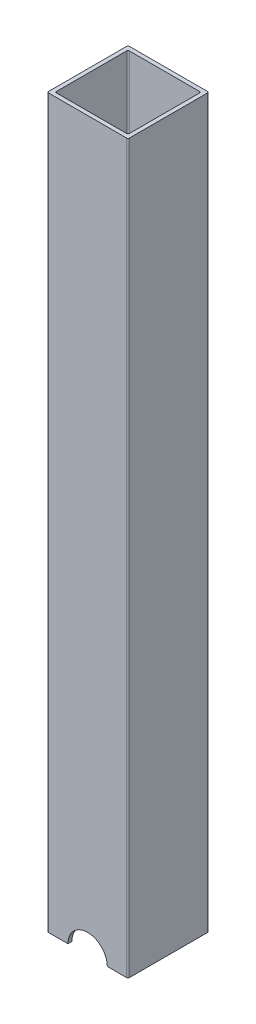
ISO-10303-21;
HEADER;
FILE_DESCRIPTION(('STEP AP214'),'2;1');
FILE_NAME('part.step','',(''),(''),'','','');
FILE_SCHEMA(('AUTOMOTIVE_DESIGN { 1 0 10303 214 1 1 1 1 }'));
ENDSEC;
DATA;
#1=APPLICATION_CONTEXT('core data for automotive mechanical design processes');
#2=APPLICATION_PROTOCOL_DEFINITION('international standard','automotive_design',2000,#1);
#3=PRODUCT_CONTEXT('',#1,'mechanical');
#4=PRODUCT('Part','Part','',(#3));
#5=PRODUCT_RELATED_PRODUCT_CATEGORY('part','',(#4));
#6=PRODUCT_DEFINITION_FORMATION('','',#4);
#7=PRODUCT_DEFINITION_CONTEXT('part definition',#1,'design');
#8=PRODUCT_DEFINITION('design','',#6,#7);
#9=PRODUCT_DEFINITION_SHAPE('','',#8);
#10=(LENGTH_UNIT() NAMED_UNIT(*) SI_UNIT(.MILLI.,.METRE.));
#11=(NAMED_UNIT(*) PLANE_ANGLE_UNIT() SI_UNIT($,.RADIAN.));
#12=(NAMED_UNIT(*) SI_UNIT($,.STERADIAN.) SOLID_ANGLE_UNIT());
#13=UNCERTAINTY_MEASURE_WITH_UNIT(LENGTH_MEASURE(1.E-05),#10,'distance_accuracy_value','');
#14=(GEOMETRIC_REPRESENTATION_CONTEXT(3) GLOBAL_UNCERTAINTY_ASSIGNED_CONTEXT((#13)) GLOBAL_UNIT_ASSIGNED_CONTEXT((#10,
#11,#12)) REPRESENTATION_CONTEXT('',''));
#15=CARTESIAN_POINT('',(0.,0.,0.));
#16=DIRECTION('',(0.,0.,1.));
#17=DIRECTION('',(1.,0.,0.));
#18=AXIS2_PLACEMENT_3D('',#15,#16,#17);
#19=CARTESIAN_POINT('',(0.,-228.6,0.));
#20=DIRECTION('',(0.,-1.,0.));
#21=DIRECTION('',(0.,0.,-1.));
#22=AXIS2_PLACEMENT_3D('',#19,#20,#21);
#23=PLANE('',#22);
#24=DIRECTION('',(0.,0.,-1.));
#25=VECTOR('',#24,1.);
#26=CARTESIAN_POINT('',(6.50874999999999,-228.6,0.));
#27=LINE('',#26,#25);
#28=CARTESIAN_POINT('',(6.50874999999999,-228.6,0.));
#29=VERTEX_POINT('',#28);
#30=CARTESIAN_POINT('',(6.50874999999999,-228.6,-1.2446));
#31=VERTEX_POINT('',#30);
#32=EDGE_CURVE('E64',#29,#31,#27,.T.);
#33=ORIENTED_EDGE('',*,*,#32,.F.);
#34=DIRECTION('',(1.,0.,0.));
#35=VECTOR('',#34,1.);
#36=CARTESIAN_POINT('',(0.,-228.6,0.));
#37=LINE('',#36,#35);
#38=CARTESIAN_POINT('',(0.4064,-228.6,0.));
#39=VERTEX_POINT('',#38);
#40=EDGE_CURVE('E187',#39,#29,#37,.T.);
#41=ORIENTED_EDGE('',*,*,#40,.F.);
#42=CARTESIAN_POINT('',(0.4064,-228.6,-0.4064));
#43=DIRECTION('',(0.,-1.,0.));
#44=DIRECTION('',(0.,0.,-1.));
#45=AXIS2_PLACEMENT_3D('',#42,#43,#44);
#46=CIRCLE('',#45,0.4064);
#47=CARTESIAN_POINT('',(0.,-228.6,-0.4064));
#48=VERTEX_POINT('',#47);
#49=EDGE_CURVE('E249',#39,#48,#46,.T.);
#50=ORIENTED_EDGE('',*,*,#49,.T.);
#51=DIRECTION('',(0.,0.,1.));
#52=VECTOR('',#51,1.);
#53=CARTESIAN_POINT('',(0.,-228.6,0.));
#54=LINE('',#53,#52);
#55=CARTESIAN_POINT('',(0.,-228.6,-24.9936));
#56=VERTEX_POINT('',#55);
#57=EDGE_CURVE('E204',#56,#48,#54,.T.);
#58=ORIENTED_EDGE('',*,*,#57,.F.);
#59=CARTESIAN_POINT('',(0.4064,-228.6,-24.9936));
#60=DIRECTION('',(0.,-1.,0.));
#61=DIRECTION('',(0.,0.,-1.));
#62=AXIS2_PLACEMENT_3D('',#59,#60,#61);
#63=CIRCLE('',#62,0.4064);
#64=CARTESIAN_POINT('',(0.4064,-228.6,-25.4));
#65=VERTEX_POINT('',#64);
#66=EDGE_CURVE('E241',#56,#65,#63,.T.);
#67=ORIENTED_EDGE('',*,*,#66,.T.);
#68=DIRECTION('',(-1.,0.,0.));
#69=VECTOR('',#68,1.);
#70=CARTESIAN_POINT('',(0.,-228.6,-25.4));
#71=LINE('',#70,#69);
#72=CARTESIAN_POINT('',(6.50874999999999,-228.6,-25.4));
#73=VERTEX_POINT('',#72);
#74=EDGE_CURVE('E202',#73,#65,#71,.T.);
#75=ORIENTED_EDGE('',*,*,#74,.F.);
#76=CARTESIAN_POINT('',(6.50874999999999,-228.6,-24.1554));
#77=VERTEX_POINT('',#76);
#78=EDGE_CURVE('E193',#77,#73,#27,.T.);
#79=ORIENTED_EDGE('',*,*,#78,.F.);
#80=DIRECTION('',(-1.,0.,0.));
#81=VECTOR('',#80,1.);
#82=CARTESIAN_POINT('',(1.2446,-228.6,-24.1554));
#83=LINE('',#82,#81);
#84=CARTESIAN_POINT('',(1.651,-228.6,-24.1554));
#85=VERTEX_POINT('',#84);
#86=EDGE_CURVE('E303',#77,#85,#83,.T.);
#87=ORIENTED_EDGE('',*,*,#86,.T.);
#88=CARTESIAN_POINT('',(1.651,-228.6,-23.749));
#89=DIRECTION('',(0.,-1.,0.));
#90=DIRECTION('',(0.,0.,-1.));
#91=AXIS2_PLACEMENT_3D('',#88,#89,#90);
#92=CIRCLE('',#91,0.4064);
#93=CARTESIAN_POINT('',(1.2446,-228.6,-23.749));
#94=VERTEX_POINT('',#93);
#95=EDGE_CURVE('E49',#85,#94,#92,.F.);
#96=ORIENTED_EDGE('',*,*,#95,.T.);
#97=DIRECTION('',(0.,0.,1.));
#98=VECTOR('',#97,1.);
#99=CARTESIAN_POINT('',(1.2446,-228.6,-1.2446));
#100=LINE('',#99,#98);
#101=CARTESIAN_POINT('',(1.2446,-228.6,-1.651));
#102=VERTEX_POINT('',#101);
#103=EDGE_CURVE('E299',#94,#102,#100,.T.);
#104=ORIENTED_EDGE('',*,*,#103,.T.);
#105=CARTESIAN_POINT('',(1.651,-228.6,-1.651));
#106=DIRECTION('',(0.,-1.,0.));
#107=DIRECTION('',(0.,0.,-1.));
#108=AXIS2_PLACEMENT_3D('',#105,#106,#107);
#109=CIRCLE('',#108,0.4064);
#110=CARTESIAN_POINT('',(1.651,-228.6,-1.2446));
#111=VERTEX_POINT('',#110);
#112=EDGE_CURVE('E285',#102,#111,#109,.F.);
#113=ORIENTED_EDGE('',*,*,#112,.T.);
#114=DIRECTION('',(1.,0.,0.));
#115=VECTOR('',#114,1.);
#116=CARTESIAN_POINT('',(1.2446,-228.6,-1.2446));
#117=LINE('',#116,#115);
#118=EDGE_CURVE('E190',#111,#31,#117,.T.);
#119=ORIENTED_EDGE('',*,*,#118,.T.);
#120=EDGE_LOOP('',(#33,#41,#50,#58,#67,#75,#79,#87,#96,#104,#113,#119));
#121=FACE_BOUND('',#120,.T.);
#122=ADVANCED_FACE('F41',(#121),#23,.T.);
#123=CARTESIAN_POINT('',(0.,-228.6,0.));
#124=DIRECTION('',(-1.,0.,0.));
#125=DIRECTION('',(0.,0.,1.));
#126=AXIS2_PLACEMENT_3D('',#123,#124,#125);
#127=PLANE('',#126);
#128=ORIENTED_EDGE('',*,*,#57,.T.);
#129=DIRECTION('',(0.,1.,0.));
#130=VECTOR('',#129,1.);
#131=CARTESIAN_POINT('',(0.,-228.6,-0.4064));
#132=LINE('',#131,#130);
#133=CARTESIAN_POINT('',(0.,0.,-0.4064));
#134=VERTEX_POINT('',#133);
#135=EDGE_CURVE('E226',#48,#134,#132,.T.);
#136=ORIENTED_EDGE('',*,*,#135,.T.);
#137=DIRECTION('',(0.,0.,1.));
#138=VECTOR('',#137,1.);
#139=CARTESIAN_POINT('',(0.,0.,0.));
#140=LINE('',#139,#138);
#141=CARTESIAN_POINT('',(0.,0.,-24.9936));
#142=VERTEX_POINT('',#141);
#143=EDGE_CURVE('E212',#142,#134,#140,.T.);
#144=ORIENTED_EDGE('',*,*,#143,.F.);
#145=DIRECTION('',(0.,1.,0.));
#146=VECTOR('',#145,1.);
#147=CARTESIAN_POINT('',(0.,-228.6,-24.9936));
#148=LINE('',#147,#146);
#149=EDGE_CURVE('E211',#142,#56,#148,.F.);
#150=ORIENTED_EDGE('',*,*,#149,.T.);
#151=EDGE_LOOP('',(#128,#136,#144,#150));
#152=FACE_BOUND('',#151,.T.);
#153=ADVANCED_FACE('F373',(#152),#127,.T.);
#154=CARTESIAN_POINT('',(0.,-228.6,-25.4));
#155=DIRECTION('',(0.,0.,-1.));
#156=DIRECTION('',(-1.,0.,0.));
#157=AXIS2_PLACEMENT_3D('',#154,#155,#156);
#158=PLANE('',#157);
#159=CARTESIAN_POINT('',(12.7,-228.6,-25.4));
#160=DIRECTION('',(0.,0.,-1.));
#161=DIRECTION('',(-1.,0.,0.));
#162=AXIS2_PLACEMENT_3D('',#159,#160,#161);
#163=CIRCLE('',#162,6.19125000000001);
#164=CARTESIAN_POINT('',(18.89125,-228.6,-25.4));
#165=VERTEX_POINT('',#164);
#166=EDGE_CURVE('E182',#73,#165,#163,.T.);
#167=ORIENTED_EDGE('',*,*,#166,.F.);
#168=ORIENTED_EDGE('',*,*,#74,.T.);
#169=DIRECTION('',(0.,1.,0.));
#170=VECTOR('',#169,1.);
#171=CARTESIAN_POINT('',(0.4064,-228.6,-25.4));
#172=LINE('',#171,#170);
#173=CARTESIAN_POINT('',(0.4064,0.,-25.4));
#174=VERTEX_POINT('',#173);
#175=EDGE_CURVE('E272',#65,#174,#172,.T.);
#176=ORIENTED_EDGE('',*,*,#175,.T.);
#177=DIRECTION('',(-1.,0.,0.));
#178=VECTOR('',#177,1.);
#179=CARTESIAN_POINT('',(0.,0.,-25.4));
#180=LINE('',#179,#178);
#181=CARTESIAN_POINT('',(24.9936,0.,-25.4));
#182=VERTEX_POINT('',#181);
#183=EDGE_CURVE('E222',#182,#174,#180,.T.);
#184=ORIENTED_EDGE('',*,*,#183,.F.);
#185=DIRECTION('',(0.,1.,0.));
#186=VECTOR('',#185,1.);
#187=CARTESIAN_POINT('',(24.9936,-228.6,-25.4));
#188=LINE('',#187,#186);
#189=CARTESIAN_POINT('',(24.9936,-228.6,-25.4));
#190=VERTEX_POINT('',#189);
#191=EDGE_CURVE('E275',#182,#190,#188,.F.);
#192=ORIENTED_EDGE('',*,*,#191,.T.);
#193=EDGE_CURVE('E208',#190,#165,#71,.T.);
#194=ORIENTED_EDGE('',*,*,#193,.T.);
#195=EDGE_LOOP('',(#167,#168,#176,#184,#192,#194));
#196=FACE_BOUND('',#195,.T.);
#197=ADVANCED_FACE('F351',(#196),#158,.T.);
#198=CARTESIAN_POINT('',(25.4,-228.6,0.));
#199=DIRECTION('',(1.,0.,0.));
#200=DIRECTION('',(0.,0.,-1.));
#201=AXIS2_PLACEMENT_3D('',#198,#199,#200);
#202=PLANE('',#201);
#203=DIRECTION('',(0.,0.,-1.));
#204=VECTOR('',#203,1.);
#205=CARTESIAN_POINT('',(25.4,0.,0.));
#206=LINE('',#205,#204);
#207=CARTESIAN_POINT('',(25.4,0.,-0.4064));
#208=VERTEX_POINT('',#207);
#209=CARTESIAN_POINT('',(25.4,0.,-24.9936));
#210=VERTEX_POINT('',#209);
#211=EDGE_CURVE('E219',#208,#210,#206,.T.);
#212=ORIENTED_EDGE('',*,*,#211,.F.);
#213=DIRECTION('',(0.,1.,0.));
#214=VECTOR('',#213,1.);
#215=CARTESIAN_POINT('',(25.4,-228.6,-0.4064));
#216=LINE('',#215,#214);
#217=CARTESIAN_POINT('',(25.4,-228.6,-0.4064));
#218=VERTEX_POINT('',#217);
#219=EDGE_CURVE('E270',#208,#218,#216,.F.);
#220=ORIENTED_EDGE('',*,*,#219,.T.);
#221=DIRECTION('',(0.,0.,-1.));
#222=VECTOR('',#221,1.);
#223=CARTESIAN_POINT('',(25.4,-228.6,0.));
#224=LINE('',#223,#222);
#225=CARTESIAN_POINT('',(25.4,-228.6,-24.9936));
#226=VERTEX_POINT('',#225);
#227=EDGE_CURVE('E198',#218,#226,#224,.T.);
#228=ORIENTED_EDGE('',*,*,#227,.T.);
#229=DIRECTION('',(0.,1.,0.));
#230=VECTOR('',#229,1.);
#231=CARTESIAN_POINT('',(25.4,-228.6,-24.9936));
#232=LINE('',#231,#230);
#233=EDGE_CURVE('E267',#226,#210,#232,.T.);
#234=ORIENTED_EDGE('',*,*,#233,.T.);
#235=EDGE_LOOP('',(#212,#220,#228,#234));
#236=FACE_BOUND('',#235,.T.);
#237=ADVANCED_FACE('F361',(#236),#202,.T.);
#238=CARTESIAN_POINT('',(0.,-228.6,0.));
#239=DIRECTION('',(0.,0.,1.));
#240=DIRECTION('',(1.,0.,0.));
#241=AXIS2_PLACEMENT_3D('',#238,#239,#240);
#242=PLANE('',#241);
#243=CARTESIAN_POINT('',(12.7,-228.6,0.));
#244=DIRECTION('',(0.,0.,-1.));
#245=DIRECTION('',(-1.,0.,0.));
#246=AXIS2_PLACEMENT_3D('',#243,#244,#245);
#247=CIRCLE('',#246,6.19125000000001);
#248=CARTESIAN_POINT('',(18.89125,-228.6,0.));
#249=VERTEX_POINT('',#248);
#250=EDGE_CURVE('E175',#29,#249,#247,.T.);
#251=ORIENTED_EDGE('',*,*,#250,.T.);
#252=CARTESIAN_POINT('',(24.9936,-228.6,0.));
#253=VERTEX_POINT('',#252);
#254=EDGE_CURVE('E199',#249,#253,#37,.T.);
#255=ORIENTED_EDGE('',*,*,#254,.T.);
#256=DIRECTION('',(0.,1.,0.));
#257=VECTOR('',#256,1.);
#258=CARTESIAN_POINT('',(24.9936,-228.6,0.));
#259=LINE('',#258,#257);
#260=CARTESIAN_POINT('',(24.9936,0.,0.));
#261=VERTEX_POINT('',#260);
#262=EDGE_CURVE('E237',#253,#261,#259,.T.);
#263=ORIENTED_EDGE('',*,*,#262,.T.);
#264=DIRECTION('',(1.,0.,0.));
#265=VECTOR('',#264,1.);
#266=CARTESIAN_POINT('',(0.,0.,0.));
#267=LINE('',#266,#265);
#268=CARTESIAN_POINT('',(0.4064,0.,0.));
#269=VERTEX_POINT('',#268);
#270=EDGE_CURVE('E215',#269,#261,#267,.T.);
#271=ORIENTED_EDGE('',*,*,#270,.F.);
#272=DIRECTION('',(0.,1.,0.));
#273=VECTOR('',#272,1.);
#274=CARTESIAN_POINT('',(0.4064,-228.6,0.));
#275=LINE('',#274,#273);
#276=EDGE_CURVE('E197',#269,#39,#275,.F.);
#277=ORIENTED_EDGE('',*,*,#276,.T.);
#278=ORIENTED_EDGE('',*,*,#40,.T.);
#279=EDGE_LOOP('',(#251,#255,#263,#271,#277,#278));
#280=FACE_BOUND('',#279,.T.);
#281=ADVANCED_FACE('F194',(#280),#242,.T.);
#282=DIRECTION('',(0.,0.,-1.));
#283=VECTOR('',#282,1.);
#284=CARTESIAN_POINT('',(18.89125,-228.6,0.));
#285=LINE('',#284,#283);
#286=CARTESIAN_POINT('',(18.89125,-228.6,-24.1554));
#287=VERTEX_POINT('',#286);
#288=EDGE_CURVE('E56',#165,#287,#285,.F.);
#289=ORIENTED_EDGE('',*,*,#288,.F.);
#290=ORIENTED_EDGE('',*,*,#193,.F.);
#291=CARTESIAN_POINT('',(24.9936,-228.6,-24.9936));
#292=DIRECTION('',(0.,-1.,0.));
#293=DIRECTION('',(0.,0.,-1.));
#294=AXIS2_PLACEMENT_3D('',#291,#292,#293);
#295=CIRCLE('',#294,0.4064);
#296=EDGE_CURVE('E244',#190,#226,#295,.T.);
#297=ORIENTED_EDGE('',*,*,#296,.T.);
#298=ORIENTED_EDGE('',*,*,#227,.F.);
#299=CARTESIAN_POINT('',(24.9936,-228.6,-0.4064));
#300=DIRECTION('',(0.,-1.,0.));
#301=DIRECTION('',(0.,0.,-1.));
#302=AXIS2_PLACEMENT_3D('',#299,#300,#301);
#303=CIRCLE('',#302,0.4064);
#304=EDGE_CURVE('E246',#218,#253,#303,.T.);
#305=ORIENTED_EDGE('',*,*,#304,.T.);
#306=ORIENTED_EDGE('',*,*,#254,.F.);
#307=CARTESIAN_POINT('',(18.89125,-228.6,-1.2446));
#308=VERTEX_POINT('',#307);
#309=EDGE_CURVE('E178',#308,#249,#285,.F.);
#310=ORIENTED_EDGE('',*,*,#309,.F.);
#311=CARTESIAN_POINT('',(23.749,-228.6,-1.2446));
#312=VERTEX_POINT('',#311);
#313=EDGE_CURVE('E312',#308,#312,#117,.T.);
#314=ORIENTED_EDGE('',*,*,#313,.T.);
#315=CARTESIAN_POINT('',(23.749,-228.6,-1.651));
#316=DIRECTION('',(0.,-1.,0.));
#317=DIRECTION('',(0.,0.,-1.));
#318=AXIS2_PLACEMENT_3D('',#315,#316,#317);
#319=CIRCLE('',#318,0.4064);
#320=CARTESIAN_POINT('',(24.1554,-228.6,-1.651));
#321=VERTEX_POINT('',#320);
#322=EDGE_CURVE('E289',#312,#321,#319,.F.);
#323=ORIENTED_EDGE('',*,*,#322,.T.);
#324=DIRECTION('',(0.,0.,-1.));
#325=VECTOR('',#324,1.);
#326=CARTESIAN_POINT('',(24.1554,-228.6,-1.2446));
#327=LINE('',#326,#325);
#328=CARTESIAN_POINT('',(24.1554,-228.6,-23.749));
#329=VERTEX_POINT('',#328);
#330=EDGE_CURVE('E337',#321,#329,#327,.T.);
#331=ORIENTED_EDGE('',*,*,#330,.T.);
#332=CARTESIAN_POINT('',(23.749,-228.6,-23.749));
#333=DIRECTION('',(0.,-1.,0.));
#334=DIRECTION('',(0.,0.,-1.));
#335=AXIS2_PLACEMENT_3D('',#332,#333,#334);
#336=CIRCLE('',#335,0.4064);
#337=CARTESIAN_POINT('',(23.749,-228.6,-24.1554));
#338=VERTEX_POINT('',#337);
#339=EDGE_CURVE('E293',#329,#338,#336,.F.);
#340=ORIENTED_EDGE('',*,*,#339,.T.);
#341=EDGE_CURVE('E216',#338,#287,#83,.T.);
#342=ORIENTED_EDGE('',*,*,#341,.T.);
#343=EDGE_LOOP('',(#289,#290,#297,#298,#305,#306,#310,#314,#323,#331,#340,#342));
#344=FACE_BOUND('',#343,.T.);
#345=ADVANCED_FACE('F349',(#344),#23,.T.);
#346=CARTESIAN_POINT('',(0.,0.,0.));
#347=DIRECTION('',(0.,-1.,0.));
#348=DIRECTION('',(0.,0.,-1.));
#349=AXIS2_PLACEMENT_3D('',#346,#347,#348);
#350=PLANE('',#349);
#351=DIRECTION('',(1.,0.,0.));
#352=VECTOR('',#351,1.);
#353=CARTESIAN_POINT('',(1.2446,0.,-1.2446));
#354=LINE('',#353,#352);
#355=CARTESIAN_POINT('',(1.651,0.,-1.2446));
#356=VERTEX_POINT('',#355);
#357=CARTESIAN_POINT('',(23.749,0.,-1.2446));
#358=VERTEX_POINT('',#357);
#359=EDGE_CURVE('E329',#356,#358,#354,.T.);
#360=ORIENTED_EDGE('',*,*,#359,.F.);
#361=CARTESIAN_POINT('',(1.651,0.,-1.651));
#362=DIRECTION('',(0.,-1.,0.));
#363=DIRECTION('',(0.,0.,-1.));
#364=AXIS2_PLACEMENT_3D('',#361,#362,#363);
#365=CIRCLE('',#364,0.4064);
#366=CARTESIAN_POINT('',(1.2446,0.,-1.651));
#367=VERTEX_POINT('',#366);
#368=EDGE_CURVE('E283',#356,#367,#365,.T.);
#369=ORIENTED_EDGE('',*,*,#368,.T.);
#370=DIRECTION('',(0.,0.,1.));
#371=VECTOR('',#370,1.);
#372=CARTESIAN_POINT('',(1.2446,0.,-1.2446));
#373=LINE('',#372,#371);
#374=CARTESIAN_POINT('',(1.2446,0.,-23.749));
#375=VERTEX_POINT('',#374);
#376=EDGE_CURVE('E322',#375,#367,#373,.T.);
#377=ORIENTED_EDGE('',*,*,#376,.F.);
#378=CARTESIAN_POINT('',(1.651,0.,-23.749));
#379=DIRECTION('',(0.,-1.,0.));
#380=DIRECTION('',(0.,0.,-1.));
#381=AXIS2_PLACEMENT_3D('',#378,#379,#380);
#382=CIRCLE('',#381,0.4064);
#383=CARTESIAN_POINT('',(1.651,0.,-24.1554));
#384=VERTEX_POINT('',#383);
#385=EDGE_CURVE('E295',#375,#384,#382,.T.);
#386=ORIENTED_EDGE('',*,*,#385,.T.);
#387=DIRECTION('',(-1.,0.,0.));
#388=VECTOR('',#387,1.);
#389=CARTESIAN_POINT('',(1.2446,0.,-24.1554));
#390=LINE('',#389,#388);
#391=CARTESIAN_POINT('',(23.749,0.,-24.1554));
#392=VERTEX_POINT('',#391);
#393=EDGE_CURVE('E313',#392,#384,#390,.T.);
#394=ORIENTED_EDGE('',*,*,#393,.F.);
#395=CARTESIAN_POINT('',(23.749,0.,-23.749));
#396=DIRECTION('',(0.,-1.,0.));
#397=DIRECTION('',(0.,0.,-1.));
#398=AXIS2_PLACEMENT_3D('',#395,#396,#397);
#399=CIRCLE('',#398,0.4064);
#400=CARTESIAN_POINT('',(24.1554,0.,-23.749));
#401=VERTEX_POINT('',#400);
#402=EDGE_CURVE('E291',#392,#401,#399,.T.);
#403=ORIENTED_EDGE('',*,*,#402,.T.);
#404=DIRECTION('',(0.,0.,-1.));
#405=VECTOR('',#404,1.);
#406=CARTESIAN_POINT('',(24.1554,0.,-1.2446));
#407=LINE('',#406,#405);
#408=CARTESIAN_POINT('',(24.1554,0.,-1.651));
#409=VERTEX_POINT('',#408);
#410=EDGE_CURVE('E327',#409,#401,#407,.T.);
#411=ORIENTED_EDGE('',*,*,#410,.F.);
#412=CARTESIAN_POINT('',(23.749,0.,-1.651));
#413=DIRECTION('',(0.,-1.,0.));
#414=DIRECTION('',(0.,0.,-1.));
#415=AXIS2_PLACEMENT_3D('',#412,#413,#414);
#416=CIRCLE('',#415,0.4064);
#417=EDGE_CURVE('E287',#409,#358,#416,.T.);
#418=ORIENTED_EDGE('',*,*,#417,.T.);
#419=EDGE_LOOP('',(#360,#369,#377,#386,#394,#403,#411,#418));
#420=FACE_BOUND('',#419,.T.);
#421=ORIENTED_EDGE('',*,*,#143,.T.);
#422=CARTESIAN_POINT('',(0.4064,0.,-0.4064));
#423=DIRECTION('',(0.,-1.,0.));
#424=DIRECTION('',(0.,0.,-1.));
#425=AXIS2_PLACEMENT_3D('',#422,#423,#424);
#426=CIRCLE('',#425,0.4064);
#427=EDGE_CURVE('E235',#134,#269,#426,.F.);
#428=ORIENTED_EDGE('',*,*,#427,.T.);
#429=ORIENTED_EDGE('',*,*,#270,.T.);
#430=CARTESIAN_POINT('',(24.9936,0.,-0.4064));
#431=DIRECTION('',(0.,-1.,0.));
#432=DIRECTION('',(0.,0.,-1.));
#433=AXIS2_PLACEMENT_3D('',#430,#431,#432);
#434=CIRCLE('',#433,0.4064);
#435=EDGE_CURVE('E233',#261,#208,#434,.F.);
#436=ORIENTED_EDGE('',*,*,#435,.T.);
#437=ORIENTED_EDGE('',*,*,#211,.T.);
#438=CARTESIAN_POINT('',(24.9936,0.,-24.9936));
#439=DIRECTION('',(0.,-1.,0.));
#440=DIRECTION('',(0.,0.,-1.));
#441=AXIS2_PLACEMENT_3D('',#438,#439,#440);
#442=CIRCLE('',#441,0.4064);
#443=EDGE_CURVE('E231',#210,#182,#442,.F.);
#444=ORIENTED_EDGE('',*,*,#443,.T.);
#445=ORIENTED_EDGE('',*,*,#183,.T.);
#446=CARTESIAN_POINT('',(0.4064,0.,-24.9936));
#447=DIRECTION('',(0.,-1.,0.));
#448=DIRECTION('',(0.,0.,-1.));
#449=AXIS2_PLACEMENT_3D('',#446,#447,#448);
#450=CIRCLE('',#449,0.4064);
#451=EDGE_CURVE('E229',#174,#142,#450,.F.);
#452=ORIENTED_EDGE('',*,*,#451,.T.);
#453=EDGE_LOOP('',(#421,#428,#429,#436,#437,#444,#445,#452));
#454=FACE_BOUND('',#453,.T.);
#455=ADVANCED_FACE('F320',(#420,#454),#350,.F.);
#456=CARTESIAN_POINT('',(1.2446,-228.6,-1.2446));
#457=DIRECTION('',(-1.,0.,0.));
#458=DIRECTION('',(0.,0.,1.));
#459=AXIS2_PLACEMENT_3D('',#456,#457,#458);
#460=PLANE('',#459);
#461=ORIENTED_EDGE('',*,*,#376,.T.);
#462=DIRECTION('',(0.,1.,0.));
#463=VECTOR('',#462,1.);
#464=CARTESIAN_POINT('',(1.2446,-228.6,-1.651));
#465=LINE('',#464,#463);
#466=EDGE_CURVE('E260',#367,#102,#465,.F.);
#467=ORIENTED_EDGE('',*,*,#466,.T.);
#468=ORIENTED_EDGE('',*,*,#103,.F.);
#469=DIRECTION('',(0.,1.,0.));
#470=VECTOR('',#469,1.);
#471=CARTESIAN_POINT('',(1.2446,0.,-23.749));
#472=LINE('',#471,#470);
#473=EDGE_CURVE('E257',#94,#375,#472,.T.);
#474=ORIENTED_EDGE('',*,*,#473,.T.);
#475=EDGE_LOOP('',(#461,#467,#468,#474));
#476=FACE_BOUND('',#475,.T.);
#477=ADVANCED_FACE('F309',(#476),#460,.F.);
#478=CARTESIAN_POINT('',(1.2446,-228.6,-24.1554));
#479=DIRECTION('',(0.,0.,-1.));
#480=DIRECTION('',(-1.,0.,0.));
#481=AXIS2_PLACEMENT_3D('',#478,#479,#480);
#482=PLANE('',#481);
#483=ORIENTED_EDGE('',*,*,#86,.F.);
#484=CARTESIAN_POINT('',(12.7,-228.6,-24.1554));
#485=DIRECTION('',(0.,0.,-1.));
#486=DIRECTION('',(-1.,0.,0.));
#487=AXIS2_PLACEMENT_3D('',#484,#485,#486);
#488=CIRCLE('',#487,6.19125000000001);
#489=EDGE_CURVE('E191',#77,#287,#488,.T.);
#490=ORIENTED_EDGE('',*,*,#489,.T.);
#491=ORIENTED_EDGE('',*,*,#341,.F.);
#492=DIRECTION('',(0.,1.,0.));
#493=VECTOR('',#492,1.);
#494=CARTESIAN_POINT('',(23.749,0.,-24.1554));
#495=LINE('',#494,#493);
#496=EDGE_CURVE('E280',#338,#392,#495,.T.);
#497=ORIENTED_EDGE('',*,*,#496,.T.);
#498=ORIENTED_EDGE('',*,*,#393,.T.);
#499=DIRECTION('',(0.,1.,0.));
#500=VECTOR('',#499,1.);
#501=CARTESIAN_POINT('',(1.651,-228.6,-24.1554));
#502=LINE('',#501,#500);
#503=EDGE_CURVE('E277',#384,#85,#502,.F.);
#504=ORIENTED_EDGE('',*,*,#503,.T.);
#505=EDGE_LOOP('',(#483,#490,#491,#497,#498,#504));
#506=FACE_BOUND('',#505,.T.);
#507=ADVANCED_FACE('F324',(#506),#482,.F.);
#508=CARTESIAN_POINT('',(24.1554,-228.6,-1.2446));
#509=DIRECTION('',(1.,0.,0.));
#510=DIRECTION('',(0.,0.,-1.));
#511=AXIS2_PLACEMENT_3D('',#508,#509,#510);
#512=PLANE('',#511);
#513=ORIENTED_EDGE('',*,*,#330,.F.);
#514=DIRECTION('',(0.,1.,0.));
#515=VECTOR('',#514,1.);
#516=CARTESIAN_POINT('',(24.1554,0.,-1.651));
#517=LINE('',#516,#515);
#518=EDGE_CURVE('E264',#321,#409,#517,.T.);
#519=ORIENTED_EDGE('',*,*,#518,.T.);
#520=ORIENTED_EDGE('',*,*,#410,.T.);
#521=DIRECTION('',(0.,1.,0.));
#522=VECTOR('',#521,1.);
#523=CARTESIAN_POINT('',(24.1554,-228.6,-23.749));
#524=LINE('',#523,#522);
#525=EDGE_CURVE('E262',#401,#329,#524,.F.);
#526=ORIENTED_EDGE('',*,*,#525,.T.);
#527=EDGE_LOOP('',(#513,#519,#520,#526));
#528=FACE_BOUND('',#527,.T.);
#529=ADVANCED_FACE('F386',(#528),#512,.F.);
#530=CARTESIAN_POINT('',(1.2446,-228.6,-1.2446));
#531=DIRECTION('',(0.,0.,1.));
#532=DIRECTION('',(1.,0.,0.));
#533=AXIS2_PLACEMENT_3D('',#530,#531,#532);
#534=PLANE('',#533);
#535=ORIENTED_EDGE('',*,*,#313,.F.);
#536=CARTESIAN_POINT('',(12.7,-228.6,-1.2446));
#537=DIRECTION('',(0.,0.,1.));
#538=DIRECTION('',(1.,0.,0.));
#539=AXIS2_PLACEMENT_3D('',#536,#537,#538);
#540=CIRCLE('',#539,6.19125000000001);
#541=EDGE_CURVE('E11',#308,#31,#540,.T.);
#542=ORIENTED_EDGE('',*,*,#541,.T.);
#543=ORIENTED_EDGE('',*,*,#118,.F.);
#544=DIRECTION('',(0.,1.,0.));
#545=VECTOR('',#544,1.);
#546=CARTESIAN_POINT('',(1.651,0.,-1.2446));
#547=LINE('',#546,#545);
#548=EDGE_CURVE('E254',#111,#356,#547,.T.);
#549=ORIENTED_EDGE('',*,*,#548,.T.);
#550=ORIENTED_EDGE('',*,*,#359,.T.);
#551=DIRECTION('',(0.,1.,0.));
#552=VECTOR('',#551,1.);
#553=CARTESIAN_POINT('',(23.749,-228.6,-1.2446));
#554=LINE('',#553,#552);
#555=EDGE_CURVE('E251',#358,#312,#554,.F.);
#556=ORIENTED_EDGE('',*,*,#555,.T.);
#557=EDGE_LOOP('',(#535,#542,#543,#549,#550,#556));
#558=FACE_BOUND('',#557,.T.);
#559=ADVANCED_FACE('F393',(#558),#534,.F.);
#560=CARTESIAN_POINT('',(0.4064,-228.6,-0.4064));
#561=DIRECTION('',(0.,1.,0.));
#562=DIRECTION('',(0.,0.,1.));
#563=AXIS2_PLACEMENT_3D('',#560,#561,#562);
#564=CYLINDRICAL_SURFACE('',#563,0.4064);
#565=ORIENTED_EDGE('',*,*,#49,.F.);
#566=ORIENTED_EDGE('',*,*,#276,.F.);
#567=ORIENTED_EDGE('',*,*,#427,.F.);
#568=ORIENTED_EDGE('',*,*,#135,.F.);
#569=EDGE_LOOP('',(#565,#566,#567,#568));
#570=FACE_BOUND('',#569,.T.);
#571=ADVANCED_FACE('F370',(#570),#564,.T.);
#572=CARTESIAN_POINT('',(1.651,-228.6,-1.651));
#573=DIRECTION('',(0.,-1.,0.));
#574=DIRECTION('',(0.,0.,-1.));
#575=AXIS2_PLACEMENT_3D('',#572,#573,#574);
#576=CYLINDRICAL_SURFACE('',#575,0.4064);
#577=ORIENTED_EDGE('',*,*,#112,.F.);
#578=ORIENTED_EDGE('',*,*,#466,.F.);
#579=ORIENTED_EDGE('',*,*,#368,.F.);
#580=ORIENTED_EDGE('',*,*,#548,.F.);
#581=EDGE_LOOP('',(#577,#578,#579,#580));
#582=FACE_BOUND('',#581,.T.);
#583=ADVANCED_FACE('F396',(#582),#576,.F.);
#584=CARTESIAN_POINT('',(23.749,-228.6,-1.651));
#585=DIRECTION('',(0.,-1.,0.));
#586=DIRECTION('',(0.,0.,-1.));
#587=AXIS2_PLACEMENT_3D('',#584,#585,#586);
#588=CYLINDRICAL_SURFACE('',#587,0.4064);
#589=ORIENTED_EDGE('',*,*,#322,.F.);
#590=ORIENTED_EDGE('',*,*,#555,.F.);
#591=ORIENTED_EDGE('',*,*,#417,.F.);
#592=ORIENTED_EDGE('',*,*,#518,.F.);
#593=EDGE_LOOP('',(#589,#590,#591,#592));
#594=FACE_BOUND('',#593,.T.);
#595=ADVANCED_FACE('F390',(#594),#588,.F.);
#596=CARTESIAN_POINT('',(24.9936,-228.6,-0.4064));
#597=DIRECTION('',(0.,1.,0.));
#598=DIRECTION('',(0.,0.,1.));
#599=AXIS2_PLACEMENT_3D('',#596,#597,#598);
#600=CYLINDRICAL_SURFACE('',#599,0.4064);
#601=ORIENTED_EDGE('',*,*,#304,.F.);
#602=ORIENTED_EDGE('',*,*,#219,.F.);
#603=ORIENTED_EDGE('',*,*,#435,.F.);
#604=ORIENTED_EDGE('',*,*,#262,.F.);
#605=EDGE_LOOP('',(#601,#602,#603,#604));
#606=FACE_BOUND('',#605,.T.);
#607=ADVANCED_FACE('F364',(#606),#600,.T.);
#608=CARTESIAN_POINT('',(24.9936,-228.6,-24.9936));
#609=DIRECTION('',(0.,1.,0.));
#610=DIRECTION('',(0.,0.,1.));
#611=AXIS2_PLACEMENT_3D('',#608,#609,#610);
#612=CYLINDRICAL_SURFACE('',#611,0.4064);
#613=ORIENTED_EDGE('',*,*,#296,.F.);
#614=ORIENTED_EDGE('',*,*,#191,.F.);
#615=ORIENTED_EDGE('',*,*,#443,.F.);
#616=ORIENTED_EDGE('',*,*,#233,.F.);
#617=EDGE_LOOP('',(#613,#614,#615,#616));
#618=FACE_BOUND('',#617,.T.);
#619=ADVANCED_FACE('F355',(#618),#612,.T.);
#620=CARTESIAN_POINT('',(23.749,-228.6,-23.749));
#621=DIRECTION('',(0.,-1.,0.));
#622=DIRECTION('',(0.,0.,-1.));
#623=AXIS2_PLACEMENT_3D('',#620,#621,#622);
#624=CYLINDRICAL_SURFACE('',#623,0.4064);
#625=ORIENTED_EDGE('',*,*,#339,.F.);
#626=ORIENTED_EDGE('',*,*,#525,.F.);
#627=ORIENTED_EDGE('',*,*,#402,.F.);
#628=ORIENTED_EDGE('',*,*,#496,.F.);
#629=EDGE_LOOP('',(#625,#626,#627,#628));
#630=FACE_BOUND('',#629,.T.);
#631=ADVANCED_FACE('F381',(#630),#624,.F.);
#632=CARTESIAN_POINT('',(1.651,-228.6,-23.749));
#633=DIRECTION('',(0.,-1.,0.));
#634=DIRECTION('',(0.,0.,-1.));
#635=AXIS2_PLACEMENT_3D('',#632,#633,#634);
#636=CYLINDRICAL_SURFACE('',#635,0.4064);
#637=ORIENTED_EDGE('',*,*,#95,.F.);
#638=ORIENTED_EDGE('',*,*,#503,.F.);
#639=ORIENTED_EDGE('',*,*,#385,.F.);
#640=ORIENTED_EDGE('',*,*,#473,.F.);
#641=EDGE_LOOP('',(#637,#638,#639,#640));
#642=FACE_BOUND('',#641,.T.);
#643=ADVANCED_FACE('F315',(#642),#636,.F.);
#644=CARTESIAN_POINT('',(0.4064,-228.6,-24.9936));
#645=DIRECTION('',(0.,1.,0.));
#646=DIRECTION('',(0.,0.,1.));
#647=AXIS2_PLACEMENT_3D('',#644,#645,#646);
#648=CYLINDRICAL_SURFACE('',#647,0.4064);
#649=ORIENTED_EDGE('',*,*,#66,.F.);
#650=ORIENTED_EDGE('',*,*,#149,.F.);
#651=ORIENTED_EDGE('',*,*,#451,.F.);
#652=ORIENTED_EDGE('',*,*,#175,.F.);
#653=EDGE_LOOP('',(#649,#650,#651,#652));
#654=FACE_BOUND('',#653,.T.);
#655=ADVANCED_FACE('F43',(#654),#648,.T.);
#656=CARTESIAN_POINT('',(12.7,-228.6,0.));
#657=DIRECTION('',(0.,0.,-1.));
#658=DIRECTION('',(-1.,0.,0.));
#659=AXIS2_PLACEMENT_3D('',#656,#657,#658);
#660=CYLINDRICAL_SURFACE('',#659,6.19125000000001);
#661=ORIENTED_EDGE('',*,*,#32,.T.);
#662=ORIENTED_EDGE('',*,*,#541,.F.);
#663=ORIENTED_EDGE('',*,*,#309,.T.);
#664=ORIENTED_EDGE('',*,*,#250,.F.);
#665=EDGE_LOOP('',(#661,#662,#663,#664));
#666=FACE_BOUND('',#665,.T.);
#667=ADVANCED_FACE('F176',(#666),#660,.F.);
#668=ORIENTED_EDGE('',*,*,#78,.T.);
#669=ORIENTED_EDGE('',*,*,#166,.T.);
#670=ORIENTED_EDGE('',*,*,#288,.T.);
#671=ORIENTED_EDGE('',*,*,#489,.F.);
#672=EDGE_LOOP('',(#668,#669,#670,#671));
#673=FACE_BOUND('',#672,.T.);
#674=ADVANCED_FACE('F344',(#673),#660,.F.);
#675=CLOSED_SHELL('',(#122,#153,#197,#237,#281,#345,#455,#477,#507,#529,#559,#571,#583,#595,
#607,#619,#631,#643,#655,#667,#674));
#676=MANIFOLD_SOLID_BREP('B2',#675);
#677=ADVANCED_BREP_SHAPE_REPRESENTATION('',(#18,#676),#14);
#678=SHAPE_DEFINITION_REPRESENTATION(#9,#677);
ENDSEC;
END-ISO-10303-21;
